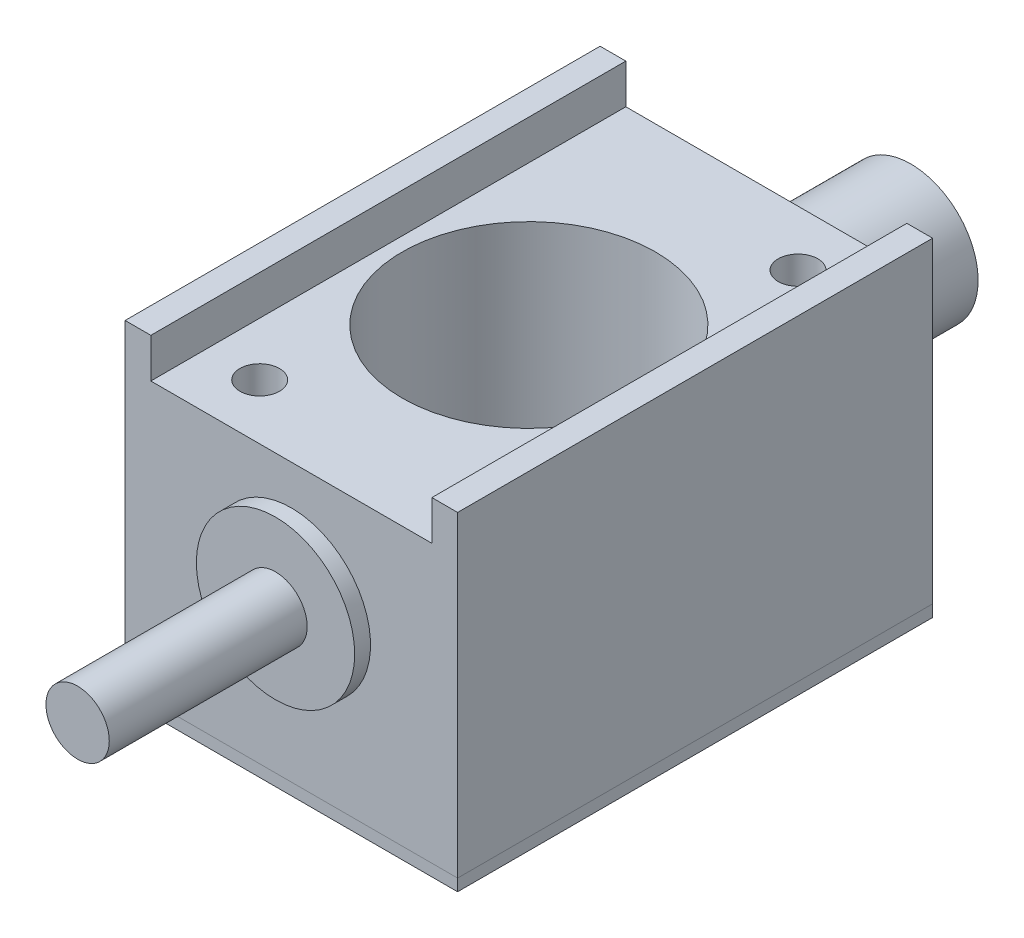
ISO-10303-21;
HEADER;
FILE_DESCRIPTION(('STEP AP214'),'2;1');
FILE_NAME('part.step','',(''),(''),'','','');
FILE_SCHEMA(('AUTOMOTIVE_DESIGN { 1 0 10303 214 1 1 1 1 }'));
ENDSEC;
DATA;
#1=APPLICATION_CONTEXT('core data for automotive mechanical design processes');
#2=APPLICATION_PROTOCOL_DEFINITION('international standard','automotive_design',2000,#1);
#3=PRODUCT_CONTEXT('',#1,'mechanical');
#4=PRODUCT('Part','Part','',(#3));
#5=PRODUCT_RELATED_PRODUCT_CATEGORY('part','',(#4));
#6=PRODUCT_DEFINITION_FORMATION('','',#4);
#7=PRODUCT_DEFINITION_CONTEXT('part definition',#1,'design');
#8=PRODUCT_DEFINITION('design','',#6,#7);
#9=PRODUCT_DEFINITION_SHAPE('','',#8);
#10=(LENGTH_UNIT() NAMED_UNIT(*) SI_UNIT(.MILLI.,.METRE.));
#11=(NAMED_UNIT(*) PLANE_ANGLE_UNIT() SI_UNIT($,.RADIAN.));
#12=(NAMED_UNIT(*) SI_UNIT($,.STERADIAN.) SOLID_ANGLE_UNIT());
#13=UNCERTAINTY_MEASURE_WITH_UNIT(LENGTH_MEASURE(1.E-05),#10,'distance_accuracy_value','');
#14=(GEOMETRIC_REPRESENTATION_CONTEXT(3) GLOBAL_UNCERTAINTY_ASSIGNED_CONTEXT((#13)) GLOBAL_UNIT_ASSIGNED_CONTEXT((#10,
#11,#12)) REPRESENTATION_CONTEXT('',''));
#15=CARTESIAN_POINT('',(0.,0.,0.));
#16=DIRECTION('',(0.,0.,1.));
#17=DIRECTION('',(1.,0.,0.));
#18=AXIS2_PLACEMENT_3D('',#15,#16,#17);
#19=CARTESIAN_POINT('',(0.,-21.5,0.));
#20=DIRECTION('',(0.,-1.,0.));
#21=DIRECTION('',(0.,0.,-1.));
#22=AXIS2_PLACEMENT_3D('',#19,#20,#21);
#23=PLANE('',#22);
#24=CARTESIAN_POINT('',(-11.2,-21.5,30.));
#25=DIRECTION('',(0.,-1.,0.));
#26=DIRECTION('',(0.,0.,-1.));
#27=AXIS2_PLACEMENT_3D('',#24,#25,#26);
#28=CIRCLE('',#27,1.55);
#29=CARTESIAN_POINT('',(-11.2,-21.5,28.45));
#30=VERTEX_POINT('',#29);
#31=EDGE_CURVE('E161',#30,#30,#28,.T.);
#32=ORIENTED_EDGE('',*,*,#31,.F.);
#33=EDGE_LOOP('',(#32));
#34=FACE_BOUND('',#33,.T.);
#35=CARTESIAN_POINT('',(0.,-21.5,40.7));
#36=DIRECTION('',(0.,-1.,0.));
#37=DIRECTION('',(0.,0.,-1.));
#38=AXIS2_PLACEMENT_3D('',#35,#36,#37);
#39=CIRCLE('',#38,1.6);
#40=CARTESIAN_POINT('',(0.,-21.5,39.1));
#41=VERTEX_POINT('',#40);
#42=EDGE_CURVE('E149',#41,#41,#39,.T.);
#43=ORIENTED_EDGE('',*,*,#42,.F.);
#44=EDGE_LOOP('',(#43));
#45=FACE_BOUND('',#44,.T.);
#46=CARTESIAN_POINT('',(11.,-21.5,7.));
#47=DIRECTION('',(0.,-1.,0.));
#48=DIRECTION('',(0.,0.,-1.));
#49=AXIS2_PLACEMENT_3D('',#46,#47,#48);
#50=CIRCLE('',#49,2.5);
#51=CARTESIAN_POINT('',(11.,-21.5,4.5));
#52=VERTEX_POINT('',#51);
#53=EDGE_CURVE('E137',#52,#52,#50,.T.);
#54=ORIENTED_EDGE('',*,*,#53,.F.);
#55=EDGE_LOOP('',(#54));
#56=FACE_BOUND('',#55,.T.);
#57=DIRECTION('',(0.,0.,-1.));
#58=VECTOR('',#57,1.);
#59=CARTESIAN_POINT('',(-21.,-21.5,60.));
#60=LINE('',#59,#58);
#61=CARTESIAN_POINT('',(-21.,-21.5,60.));
#62=VERTEX_POINT('',#61);
#63=CARTESIAN_POINT('',(-21.,-21.5,0.));
#64=VERTEX_POINT('',#63);
#65=EDGE_CURVE('E107',#62,#64,#60,.T.);
#66=ORIENTED_EDGE('',*,*,#65,.T.);
#67=DIRECTION('',(1.,0.,0.));
#68=VECTOR('',#67,1.);
#69=CARTESIAN_POINT('',(-21.,-21.5,0.));
#70=LINE('',#69,#68);
#71=CARTESIAN_POINT('',(21.,-21.5,0.));
#72=VERTEX_POINT('',#71);
#73=EDGE_CURVE('E102',#64,#72,#70,.T.);
#74=ORIENTED_EDGE('',*,*,#73,.T.);
#75=DIRECTION('',(0.,0.,1.));
#76=VECTOR('',#75,1.);
#77=CARTESIAN_POINT('',(21.,-21.5,60.));
#78=LINE('',#77,#76);
#79=CARTESIAN_POINT('',(21.,-21.5,60.));
#80=VERTEX_POINT('',#79);
#81=EDGE_CURVE('E105',#72,#80,#78,.T.);
#82=ORIENTED_EDGE('',*,*,#81,.T.);
#83=DIRECTION('',(-1.,0.,0.));
#84=VECTOR('',#83,1.);
#85=CARTESIAN_POINT('',(-21.,-21.5,60.));
#86=LINE('',#85,#84);
#87=EDGE_CURVE('E72',#80,#62,#86,.T.);
#88=ORIENTED_EDGE('',*,*,#87,.T.);
#89=EDGE_LOOP('',(#66,#74,#82,#88));
#90=FACE_BOUND('',#89,.T.);
#91=CARTESIAN_POINT('',(-11.,-21.5,53.));
#92=DIRECTION('',(0.,-1.,0.));
#93=DIRECTION('',(0.,0.,-1.));
#94=AXIS2_PLACEMENT_3D('',#91,#92,#93);
#95=CIRCLE('',#94,2.5);
#96=CARTESIAN_POINT('',(-11.,-21.5,50.5));
#97=VERTEX_POINT('',#96);
#98=EDGE_CURVE('E122',#97,#97,#95,.T.);
#99=ORIENTED_EDGE('',*,*,#98,.F.);
#100=EDGE_LOOP('',(#99));
#101=FACE_BOUND('',#100,.T.);
#102=CARTESIAN_POINT('',(0.,-21.5,30.));
#103=DIRECTION('',(0.,-1.,0.));
#104=DIRECTION('',(0.,0.,-1.));
#105=AXIS2_PLACEMENT_3D('',#102,#103,#104);
#106=CIRCLE('',#105,6.75);
#107=CARTESIAN_POINT('',(0.,-21.5,23.25));
#108=VERTEX_POINT('',#107);
#109=EDGE_CURVE('E143',#108,#108,#106,.T.);
#110=ORIENTED_EDGE('',*,*,#109,.F.);
#111=EDGE_LOOP('',(#110));
#112=FACE_BOUND('',#111,.T.);
#113=CARTESIAN_POINT('',(0.,-21.5,19.3));
#114=DIRECTION('',(0.,-1.,0.));
#115=DIRECTION('',(0.,0.,-1.));
#116=AXIS2_PLACEMENT_3D('',#113,#114,#115);
#117=CIRCLE('',#116,1.6);
#118=CARTESIAN_POINT('',(0.,-21.5,17.7));
#119=VERTEX_POINT('',#118);
#120=EDGE_CURVE('E155',#119,#119,#117,.T.);
#121=ORIENTED_EDGE('',*,*,#120,.F.);
#122=EDGE_LOOP('',(#121));
#123=FACE_BOUND('',#122,.T.);
#124=CARTESIAN_POINT('',(11.2,-21.5,30.));
#125=DIRECTION('',(0.,-1.,0.));
#126=DIRECTION('',(0.,0.,-1.));
#127=AXIS2_PLACEMENT_3D('',#124,#125,#126);
#128=CIRCLE('',#127,1.55);
#129=CARTESIAN_POINT('',(11.2,-21.5,28.45));
#130=VERTEX_POINT('',#129);
#131=EDGE_CURVE('E167',#130,#130,#128,.T.);
#132=ORIENTED_EDGE('',*,*,#131,.F.);
#133=EDGE_LOOP('',(#132));
#134=FACE_BOUND('',#133,.T.);
#135=ADVANCED_FACE('F55',(#34,#45,#56,#90,#101,#112,#123,#134),#23,.T.);
#136=CARTESIAN_POINT('',(0.,-20.,0.));
#137=DIRECTION('',(0.,-1.,0.));
#138=DIRECTION('',(0.,0.,-1.));
#139=AXIS2_PLACEMENT_3D('',#136,#137,#138);
#140=PLANE('',#139);
#141=DIRECTION('',(0.,0.,-1.));
#142=VECTOR('',#141,1.);
#143=CARTESIAN_POINT('',(-21.,-20.,60.));
#144=LINE('',#143,#142);
#145=CARTESIAN_POINT('',(-21.,-20.,60.));
#146=VERTEX_POINT('',#145);
#147=CARTESIAN_POINT('',(-21.,-20.,0.));
#148=VERTEX_POINT('',#147);
#149=EDGE_CURVE('E119',#146,#148,#144,.T.);
#150=ORIENTED_EDGE('',*,*,#149,.F.);
#151=DIRECTION('',(-1.,0.,0.));
#152=VECTOR('',#151,1.);
#153=CARTESIAN_POINT('',(-21.,-20.,60.));
#154=LINE('',#153,#152);
#155=CARTESIAN_POINT('',(21.,-20.,60.));
#156=VERTEX_POINT('',#155);
#157=EDGE_CURVE('E95',#156,#146,#154,.T.);
#158=ORIENTED_EDGE('',*,*,#157,.F.);
#159=DIRECTION('',(0.,0.,1.));
#160=VECTOR('',#159,1.);
#161=CARTESIAN_POINT('',(21.,-20.,60.));
#162=LINE('',#161,#160);
#163=CARTESIAN_POINT('',(21.,-20.,0.));
#164=VERTEX_POINT('',#163);
#165=EDGE_CURVE('E89',#164,#156,#162,.T.);
#166=ORIENTED_EDGE('',*,*,#165,.F.);
#167=DIRECTION('',(1.,0.,0.));
#168=VECTOR('',#167,1.);
#169=CARTESIAN_POINT('',(-21.,-20.,0.));
#170=LINE('',#169,#168);
#171=EDGE_CURVE('E111',#148,#164,#170,.T.);
#172=ORIENTED_EDGE('',*,*,#171,.F.);
#173=EDGE_LOOP('',(#150,#158,#166,#172));
#174=FACE_BOUND('',#173,.T.);
#175=CARTESIAN_POINT('',(-11.,-20.,53.));
#176=DIRECTION('',(0.,-1.,0.));
#177=DIRECTION('',(0.,0.,-1.));
#178=AXIS2_PLACEMENT_3D('',#175,#176,#177);
#179=CIRCLE('',#178,2.5);
#180=CARTESIAN_POINT('',(-11.,-20.,50.5));
#181=VERTEX_POINT('',#180);
#182=EDGE_CURVE('E134',#181,#181,#179,.T.);
#183=ORIENTED_EDGE('',*,*,#182,.T.);
#184=EDGE_LOOP('',(#183));
#185=FACE_BOUND('',#184,.T.);
#186=CARTESIAN_POINT('',(11.,-20.,7.));
#187=DIRECTION('',(0.,-1.,0.));
#188=DIRECTION('',(0.,0.,-1.));
#189=AXIS2_PLACEMENT_3D('',#186,#187,#188);
#190=CIRCLE('',#189,2.5);
#191=CARTESIAN_POINT('',(11.,-20.,4.5));
#192=VERTEX_POINT('',#191);
#193=EDGE_CURVE('E140',#192,#192,#190,.T.);
#194=ORIENTED_EDGE('',*,*,#193,.T.);
#195=EDGE_LOOP('',(#194));
#196=FACE_BOUND('',#195,.T.);
#197=CARTESIAN_POINT('',(0.,-20.,30.));
#198=DIRECTION('',(0.,-1.,0.));
#199=DIRECTION('',(0.,0.,-1.));
#200=AXIS2_PLACEMENT_3D('',#197,#198,#199);
#201=CIRCLE('',#200,6.75);
#202=CARTESIAN_POINT('',(0.,-20.,23.25));
#203=VERTEX_POINT('',#202);
#204=EDGE_CURVE('E146',#203,#203,#201,.T.);
#205=ORIENTED_EDGE('',*,*,#204,.T.);
#206=EDGE_LOOP('',(#205));
#207=FACE_BOUND('',#206,.T.);
#208=CARTESIAN_POINT('',(0.,-20.,40.7));
#209=DIRECTION('',(0.,-1.,0.));
#210=DIRECTION('',(0.,0.,-1.));
#211=AXIS2_PLACEMENT_3D('',#208,#209,#210);
#212=CIRCLE('',#211,1.6);
#213=CARTESIAN_POINT('',(0.,-20.,39.1));
#214=VERTEX_POINT('',#213);
#215=EDGE_CURVE('E152',#214,#214,#212,.T.);
#216=ORIENTED_EDGE('',*,*,#215,.T.);
#217=EDGE_LOOP('',(#216));
#218=FACE_BOUND('',#217,.T.);
#219=CARTESIAN_POINT('',(0.,-20.,19.3));
#220=DIRECTION('',(0.,-1.,0.));
#221=DIRECTION('',(0.,0.,-1.));
#222=AXIS2_PLACEMENT_3D('',#219,#220,#221);
#223=CIRCLE('',#222,1.6);
#224=CARTESIAN_POINT('',(0.,-20.,17.7));
#225=VERTEX_POINT('',#224);
#226=EDGE_CURVE('E158',#225,#225,#223,.T.);
#227=ORIENTED_EDGE('',*,*,#226,.T.);
#228=EDGE_LOOP('',(#227));
#229=FACE_BOUND('',#228,.T.);
#230=CARTESIAN_POINT('',(-11.2,-20.,30.));
#231=DIRECTION('',(0.,-1.,0.));
#232=DIRECTION('',(0.,0.,-1.));
#233=AXIS2_PLACEMENT_3D('',#230,#231,#232);
#234=CIRCLE('',#233,1.55);
#235=CARTESIAN_POINT('',(-11.2,-20.,28.45));
#236=VERTEX_POINT('',#235);
#237=EDGE_CURVE('E164',#236,#236,#234,.T.);
#238=ORIENTED_EDGE('',*,*,#237,.T.);
#239=EDGE_LOOP('',(#238));
#240=FACE_BOUND('',#239,.T.);
#241=CARTESIAN_POINT('',(11.2,-20.,30.));
#242=DIRECTION('',(0.,-1.,0.));
#243=DIRECTION('',(0.,0.,-1.));
#244=AXIS2_PLACEMENT_3D('',#241,#242,#243);
#245=CIRCLE('',#244,1.55);
#246=CARTESIAN_POINT('',(11.2,-20.,28.45));
#247=VERTEX_POINT('',#246);
#248=EDGE_CURVE('E170',#247,#247,#245,.T.);
#249=ORIENTED_EDGE('',*,*,#248,.T.);
#250=EDGE_LOOP('',(#249));
#251=FACE_BOUND('',#250,.T.);
#252=ADVANCED_FACE('F130',(#174,#185,#196,#207,#218,#229,#240,#251),#140,.F.);
#253=CARTESIAN_POINT('',(-21.,-21.5,60.));
#254=DIRECTION('',(1.,0.,0.));
#255=DIRECTION('',(0.,0.,-1.));
#256=AXIS2_PLACEMENT_3D('',#253,#254,#255);
#257=PLANE('',#256);
#258=ORIENTED_EDGE('',*,*,#149,.T.);
#259=DIRECTION('',(0.,1.,0.));
#260=VECTOR('',#259,1.);
#261=CARTESIAN_POINT('',(-21.,-21.5,0.));
#262=LINE('',#261,#260);
#263=EDGE_CURVE('E12',#64,#148,#262,.T.);
#264=ORIENTED_EDGE('',*,*,#263,.F.);
#265=ORIENTED_EDGE('',*,*,#65,.F.);
#266=DIRECTION('',(0.,1.,0.));
#267=VECTOR('',#266,1.);
#268=CARTESIAN_POINT('',(-21.,-21.5,60.));
#269=LINE('',#268,#267);
#270=EDGE_CURVE('E115',#62,#146,#269,.T.);
#271=ORIENTED_EDGE('',*,*,#270,.T.);
#272=EDGE_LOOP('',(#258,#264,#265,#271));
#273=FACE_BOUND('',#272,.T.);
#274=ADVANCED_FACE('F57',(#273),#257,.F.);
#275=CARTESIAN_POINT('',(-21.,-21.5,0.));
#276=DIRECTION('',(0.,0.,1.));
#277=DIRECTION('',(1.,0.,0.));
#278=AXIS2_PLACEMENT_3D('',#275,#276,#277);
#279=PLANE('',#278);
#280=ORIENTED_EDGE('',*,*,#171,.T.);
#281=DIRECTION('',(0.,1.,0.));
#282=VECTOR('',#281,1.);
#283=CARTESIAN_POINT('',(21.,-21.5,0.));
#284=LINE('',#283,#282);
#285=EDGE_CURVE('E64',#72,#164,#284,.T.);
#286=ORIENTED_EDGE('',*,*,#285,.F.);
#287=ORIENTED_EDGE('',*,*,#73,.F.);
#288=ORIENTED_EDGE('',*,*,#263,.T.);
#289=EDGE_LOOP('',(#280,#286,#287,#288));
#290=FACE_BOUND('',#289,.T.);
#291=ADVANCED_FACE('F110',(#290),#279,.F.);
#292=CARTESIAN_POINT('',(21.,-21.5,60.));
#293=DIRECTION('',(-1.,0.,0.));
#294=DIRECTION('',(0.,0.,1.));
#295=AXIS2_PLACEMENT_3D('',#292,#293,#294);
#296=PLANE('',#295);
#297=ORIENTED_EDGE('',*,*,#165,.T.);
#298=DIRECTION('',(0.,1.,0.));
#299=VECTOR('',#298,1.);
#300=CARTESIAN_POINT('',(21.,-21.5,60.));
#301=LINE('',#300,#299);
#302=EDGE_CURVE('E112',#80,#156,#301,.T.);
#303=ORIENTED_EDGE('',*,*,#302,.F.);
#304=ORIENTED_EDGE('',*,*,#81,.F.);
#305=ORIENTED_EDGE('',*,*,#285,.T.);
#306=EDGE_LOOP('',(#297,#303,#304,#305));
#307=FACE_BOUND('',#306,.T.);
#308=ADVANCED_FACE('F113',(#307),#296,.F.);
#309=CARTESIAN_POINT('',(-21.,-21.5,60.));
#310=DIRECTION('',(0.,0.,-1.));
#311=DIRECTION('',(-1.,0.,0.));
#312=AXIS2_PLACEMENT_3D('',#309,#310,#311);
#313=PLANE('',#312);
#314=ORIENTED_EDGE('',*,*,#157,.T.);
#315=ORIENTED_EDGE('',*,*,#270,.F.);
#316=ORIENTED_EDGE('',*,*,#87,.F.);
#317=ORIENTED_EDGE('',*,*,#302,.T.);
#318=EDGE_LOOP('',(#314,#315,#316,#317));
#319=FACE_BOUND('',#318,.T.);
#320=ADVANCED_FACE('F127',(#319),#313,.F.);
#321=CARTESIAN_POINT('',(-11.,-21.5,53.));
#322=DIRECTION('',(0.,1.,0.));
#323=DIRECTION('',(0.,0.,1.));
#324=AXIS2_PLACEMENT_3D('',#321,#322,#323);
#325=CYLINDRICAL_SURFACE('',#324,2.5);
#326=ORIENTED_EDGE('',*,*,#98,.T.);
#327=EDGE_LOOP('',(#326));
#328=FACE_BOUND('',#327,.T.);
#329=ORIENTED_EDGE('',*,*,#182,.F.);
#330=EDGE_LOOP('',(#329));
#331=FACE_BOUND('',#330,.T.);
#332=ADVANCED_FACE('F189',(#328,#331),#325,.F.);
#333=CARTESIAN_POINT('',(11.,-21.5,7.));
#334=DIRECTION('',(0.,1.,0.));
#335=DIRECTION('',(0.,0.,1.));
#336=AXIS2_PLACEMENT_3D('',#333,#334,#335);
#337=CYLINDRICAL_SURFACE('',#336,2.5);
#338=ORIENTED_EDGE('',*,*,#53,.T.);
#339=EDGE_LOOP('',(#338));
#340=FACE_BOUND('',#339,.T.);
#341=ORIENTED_EDGE('',*,*,#193,.F.);
#342=EDGE_LOOP('',(#341));
#343=FACE_BOUND('',#342,.T.);
#344=ADVANCED_FACE('F240',(#340,#343),#337,.F.);
#345=CARTESIAN_POINT('',(0.,-21.5,30.));
#346=DIRECTION('',(0.,1.,0.));
#347=DIRECTION('',(0.,0.,1.));
#348=AXIS2_PLACEMENT_3D('',#345,#346,#347);
#349=CYLINDRICAL_SURFACE('',#348,6.75);
#350=ORIENTED_EDGE('',*,*,#109,.T.);
#351=EDGE_LOOP('',(#350));
#352=FACE_BOUND('',#351,.T.);
#353=ORIENTED_EDGE('',*,*,#204,.F.);
#354=EDGE_LOOP('',(#353));
#355=FACE_BOUND('',#354,.T.);
#356=ADVANCED_FACE('F248',(#352,#355),#349,.F.);
#357=CARTESIAN_POINT('',(0.,-21.5,40.7));
#358=DIRECTION('',(0.,1.,0.));
#359=DIRECTION('',(0.,0.,1.));
#360=AXIS2_PLACEMENT_3D('',#357,#358,#359);
#361=CYLINDRICAL_SURFACE('',#360,1.6);
#362=ORIENTED_EDGE('',*,*,#42,.T.);
#363=EDGE_LOOP('',(#362));
#364=FACE_BOUND('',#363,.T.);
#365=ORIENTED_EDGE('',*,*,#215,.F.);
#366=EDGE_LOOP('',(#365));
#367=FACE_BOUND('',#366,.T.);
#368=ADVANCED_FACE('F256',(#364,#367),#361,.F.);
#369=CARTESIAN_POINT('',(0.,-21.5,19.3));
#370=DIRECTION('',(0.,1.,0.));
#371=DIRECTION('',(0.,0.,1.));
#372=AXIS2_PLACEMENT_3D('',#369,#370,#371);
#373=CYLINDRICAL_SURFACE('',#372,1.6);
#374=ORIENTED_EDGE('',*,*,#120,.T.);
#375=EDGE_LOOP('',(#374));
#376=FACE_BOUND('',#375,.T.);
#377=ORIENTED_EDGE('',*,*,#226,.F.);
#378=EDGE_LOOP('',(#377));
#379=FACE_BOUND('',#378,.T.);
#380=ADVANCED_FACE('F265',(#376,#379),#373,.F.);
#381=CARTESIAN_POINT('',(-11.2,-21.5,30.));
#382=DIRECTION('',(0.,1.,0.));
#383=DIRECTION('',(0.,0.,1.));
#384=AXIS2_PLACEMENT_3D('',#381,#382,#383);
#385=CYLINDRICAL_SURFACE('',#384,1.55);
#386=ORIENTED_EDGE('',*,*,#31,.T.);
#387=EDGE_LOOP('',(#386));
#388=FACE_BOUND('',#387,.T.);
#389=ORIENTED_EDGE('',*,*,#237,.F.);
#390=EDGE_LOOP('',(#389));
#391=FACE_BOUND('',#390,.T.);
#392=ADVANCED_FACE('F274',(#388,#391),#385,.F.);
#393=CARTESIAN_POINT('',(11.2,-21.5,30.));
#394=DIRECTION('',(0.,1.,0.));
#395=DIRECTION('',(0.,0.,1.));
#396=AXIS2_PLACEMENT_3D('',#393,#394,#395);
#397=CYLINDRICAL_SURFACE('',#396,1.55);
#398=ORIENTED_EDGE('',*,*,#131,.T.);
#399=EDGE_LOOP('',(#398));
#400=FACE_BOUND('',#399,.T.);
#401=ORIENTED_EDGE('',*,*,#248,.F.);
#402=EDGE_LOOP('',(#401));
#403=FACE_BOUND('',#402,.T.);
#404=ADVANCED_FACE('F176',(#400,#403),#397,.F.);
#405=CLOSED_SHELL('',(#135,#252,#274,#291,#308,#320,#332,#344,#356,#368,#380,#392,#404));
#406=MANIFOLD_SOLID_BREP('B2',#405);
#407=CARTESIAN_POINT('',(-21.,20.,60.));
#408=DIRECTION('',(0.,-1.,0.));
#409=DIRECTION('',(0.,0.,-1.));
#410=AXIS2_PLACEMENT_3D('',#407,#408,#409);
#411=PLANE('',#410);
#412=DIRECTION('',(0.,0.,1.));
#413=VECTOR('',#412,1.);
#414=CARTESIAN_POINT('',(17.75,20.,0.));
#415=LINE('',#414,#413);
#416=CARTESIAN_POINT('',(17.75,20.,0.));
#417=VERTEX_POINT('',#416);
#418=CARTESIAN_POINT('',(17.75,20.,60.));
#419=VERTEX_POINT('',#418);
#420=EDGE_CURVE('E458',#417,#419,#415,.T.);
#421=ORIENTED_EDGE('',*,*,#420,.T.);
#422=DIRECTION('',(-1.,0.,0.));
#423=VECTOR('',#422,1.);
#424=CARTESIAN_POINT('',(-21.,20.,60.));
#425=LINE('',#424,#423);
#426=CARTESIAN_POINT('',(21.,20.,60.));
#427=VERTEX_POINT('',#426);
#428=EDGE_CURVE('E407',#427,#419,#425,.T.);
#429=ORIENTED_EDGE('',*,*,#428,.F.);
#430=DIRECTION('',(0.,0.,-1.));
#431=VECTOR('',#430,1.);
#432=CARTESIAN_POINT('',(21.,20.,60.));
#433=LINE('',#432,#431);
#434=CARTESIAN_POINT('',(21.,20.,0.));
#435=VERTEX_POINT('',#434);
#436=EDGE_CURVE('E471',#427,#435,#433,.T.);
#437=ORIENTED_EDGE('',*,*,#436,.T.);
#438=DIRECTION('',(-1.,0.,0.));
#439=VECTOR('',#438,1.);
#440=CARTESIAN_POINT('',(-21.,20.,0.));
#441=LINE('',#440,#439);
#442=EDGE_CURVE('E453',#435,#417,#441,.T.);
#443=ORIENTED_EDGE('',*,*,#442,.T.);
#444=EDGE_LOOP('',(#421,#429,#437,#443));
#445=FACE_BOUND('',#444,.T.);
#446=ADVANCED_FACE('F352',(#445),#411,.F.);
#447=CARTESIAN_POINT('',(0.,0.,60.));
#448=DIRECTION('',(0.,0.,-1.));
#449=DIRECTION('',(-1.,0.,0.));
#450=AXIS2_PLACEMENT_3D('',#447,#448,#449);
#451=PLANE('',#450);
#452=CARTESIAN_POINT('',(0.,0.,60.));
#453=DIRECTION('',(0.,0.,-1.));
#454=DIRECTION('',(-1.,0.,0.));
#455=AXIS2_PLACEMENT_3D('',#452,#453,#454);
#456=CIRCLE('',#455,10.);
#457=CARTESIAN_POINT('',(-10.,0.,60.));
#458=VERTEX_POINT('',#457);
#459=EDGE_CURVE('E361',#458,#458,#456,.F.);
#460=ORIENTED_EDGE('',*,*,#459,.F.);
#461=EDGE_LOOP('',(#460));
#462=FACE_BOUND('',#461,.T.);
#463=DIRECTION('',(0.,-1.,0.));
#464=VECTOR('',#463,1.);
#465=CARTESIAN_POINT('',(17.75,0.,60.));
#466=LINE('',#465,#464);
#467=CARTESIAN_POINT('',(17.75,15.,60.));
#468=VERTEX_POINT('',#467);
#469=EDGE_CURVE('E439',#419,#468,#466,.T.);
#470=ORIENTED_EDGE('',*,*,#469,.T.);
#471=DIRECTION('',(1.,0.,0.));
#472=VECTOR('',#471,1.);
#473=CARTESIAN_POINT('',(0.,15.,60.));
#474=LINE('',#473,#472);
#475=CARTESIAN_POINT('',(-17.75,15.,60.));
#476=VERTEX_POINT('',#475);
#477=EDGE_CURVE('E522',#476,#468,#474,.T.);
#478=ORIENTED_EDGE('',*,*,#477,.F.);
#479=DIRECTION('',(0.,-1.,0.));
#480=VECTOR('',#479,1.);
#481=CARTESIAN_POINT('',(-17.75,0.,60.));
#482=LINE('',#481,#480);
#483=CARTESIAN_POINT('',(-17.75,20.,60.));
#484=VERTEX_POINT('',#483);
#485=EDGE_CURVE('E517',#484,#476,#482,.T.);
#486=ORIENTED_EDGE('',*,*,#485,.F.);
#487=CARTESIAN_POINT('',(-21.,20.,60.));
#488=VERTEX_POINT('',#487);
#489=EDGE_CURVE('E447',#484,#488,#425,.T.);
#490=ORIENTED_EDGE('',*,*,#489,.T.);
#491=DIRECTION('',(0.,-1.,0.));
#492=VECTOR('',#491,1.);
#493=CARTESIAN_POINT('',(-21.,-20.,60.));
#494=LINE('',#493,#492);
#495=CARTESIAN_POINT('',(-21.,-20.,60.));
#496=VERTEX_POINT('',#495);
#497=EDGE_CURVE('E533',#488,#496,#494,.T.);
#498=ORIENTED_EDGE('',*,*,#497,.T.);
#499=DIRECTION('',(1.,0.,0.));
#500=VECTOR('',#499,1.);
#501=CARTESIAN_POINT('',(-21.,-20.,60.));
#502=LINE('',#501,#500);
#503=CARTESIAN_POINT('',(21.,-20.,60.));
#504=VERTEX_POINT('',#503);
#505=EDGE_CURVE('E378',#496,#504,#502,.T.);
#506=ORIENTED_EDGE('',*,*,#505,.T.);
#507=DIRECTION('',(0.,1.,0.));
#508=VECTOR('',#507,1.);
#509=CARTESIAN_POINT('',(21.,-20.,60.));
#510=LINE('',#509,#508);
#511=EDGE_CURVE('E464',#504,#427,#510,.T.);
#512=ORIENTED_EDGE('',*,*,#511,.T.);
#513=ORIENTED_EDGE('',*,*,#428,.T.);
#514=EDGE_LOOP('',(#470,#478,#486,#490,#498,#506,#512,#513));
#515=FACE_BOUND('',#514,.T.);
#516=ADVANCED_FACE('F536',(#462,#515),#451,.F.);
#517=CARTESIAN_POINT('',(0.,0.,0.));
#518=DIRECTION('',(0.,0.,-1.));
#519=DIRECTION('',(-1.,0.,0.));
#520=AXIS2_PLACEMENT_3D('',#517,#518,#519);
#521=PLANE('',#520);
#522=CARTESIAN_POINT('',(0.,0.,0.));
#523=DIRECTION('',(0.,0.,-1.));
#524=DIRECTION('',(-1.,0.,0.));
#525=AXIS2_PLACEMENT_3D('',#522,#523,#524);
#526=CIRCLE('',#525,12.5);
#527=CARTESIAN_POINT('',(-12.5,0.,0.));
#528=VERTEX_POINT('',#527);
#529=EDGE_CURVE('E505',#528,#528,#526,.T.);
#530=ORIENTED_EDGE('',*,*,#529,.F.);
#531=EDGE_LOOP('',(#530));
#532=FACE_BOUND('',#531,.T.);
#533=DIRECTION('',(1.,0.,0.));
#534=VECTOR('',#533,1.);
#535=CARTESIAN_POINT('',(0.,15.,0.));
#536=LINE('',#535,#534);
#537=CARTESIAN_POINT('',(-17.75,15.,0.));
#538=VERTEX_POINT('',#537);
#539=CARTESIAN_POINT('',(17.75,15.,0.));
#540=VERTEX_POINT('',#539);
#541=EDGE_CURVE('E369',#538,#540,#536,.T.);
#542=ORIENTED_EDGE('',*,*,#541,.T.);
#543=DIRECTION('',(0.,-1.,0.));
#544=VECTOR('',#543,1.);
#545=CARTESIAN_POINT('',(17.75,0.,0.));
#546=LINE('',#545,#544);
#547=EDGE_CURVE('E448',#417,#540,#546,.T.);
#548=ORIENTED_EDGE('',*,*,#547,.F.);
#549=ORIENTED_EDGE('',*,*,#442,.F.);
#550=DIRECTION('',(0.,1.,0.));
#551=VECTOR('',#550,1.);
#552=CARTESIAN_POINT('',(21.,-20.,0.));
#553=LINE('',#552,#551);
#554=CARTESIAN_POINT('',(21.,-20.,0.));
#555=VERTEX_POINT('',#554);
#556=EDGE_CURVE('E454',#555,#435,#553,.T.);
#557=ORIENTED_EDGE('',*,*,#556,.F.);
#558=DIRECTION('',(1.,0.,0.));
#559=VECTOR('',#558,1.);
#560=CARTESIAN_POINT('',(-21.,-20.,0.));
#561=LINE('',#560,#559);
#562=CARTESIAN_POINT('',(-21.,-20.,0.));
#563=VERTEX_POINT('',#562);
#564=EDGE_CURVE('E399',#563,#555,#561,.T.);
#565=ORIENTED_EDGE('',*,*,#564,.F.);
#566=DIRECTION('',(0.,-1.,0.));
#567=VECTOR('',#566,1.);
#568=CARTESIAN_POINT('',(-21.,-20.,0.));
#569=LINE('',#568,#567);
#570=CARTESIAN_POINT('',(-21.,20.,0.));
#571=VERTEX_POINT('',#570);
#572=EDGE_CURVE('E452',#571,#563,#569,.T.);
#573=ORIENTED_EDGE('',*,*,#572,.F.);
#574=CARTESIAN_POINT('',(-17.75,20.,0.));
#575=VERTEX_POINT('',#574);
#576=EDGE_CURVE('E445',#575,#571,#441,.T.);
#577=ORIENTED_EDGE('',*,*,#576,.F.);
#578=DIRECTION('',(0.,-1.,0.));
#579=VECTOR('',#578,1.);
#580=CARTESIAN_POINT('',(-17.75,0.,0.));
#581=LINE('',#580,#579);
#582=EDGE_CURVE('E430',#575,#538,#581,.T.);
#583=ORIENTED_EDGE('',*,*,#582,.T.);
#584=EDGE_LOOP('',(#542,#548,#549,#557,#565,#573,#577,#583));
#585=FACE_BOUND('',#584,.T.);
#586=ADVANCED_FACE('F451',(#532,#585),#521,.T.);
#587=CARTESIAN_POINT('',(21.,-20.,60.));
#588=DIRECTION('',(-1.,0.,0.));
#589=DIRECTION('',(0.,0.,1.));
#590=AXIS2_PLACEMENT_3D('',#587,#588,#589);
#591=PLANE('',#590);
#592=ORIENTED_EDGE('',*,*,#556,.T.);
#593=ORIENTED_EDGE('',*,*,#436,.F.);
#594=ORIENTED_EDGE('',*,*,#511,.F.);
#595=DIRECTION('',(0.,0.,-1.));
#596=VECTOR('',#595,1.);
#597=CARTESIAN_POINT('',(21.,-20.,60.));
#598=LINE('',#597,#596);
#599=EDGE_CURVE('E465',#504,#555,#598,.T.);
#600=ORIENTED_EDGE('',*,*,#599,.T.);
#601=EDGE_LOOP('',(#592,#593,#594,#600));
#602=FACE_BOUND('',#601,.T.);
#603=ADVANCED_FACE('F354',(#602),#591,.F.);
#604=ORIENTED_EDGE('',*,*,#489,.F.);
#605=DIRECTION('',(0.,0.,1.));
#606=VECTOR('',#605,1.);
#607=CARTESIAN_POINT('',(-17.75,20.,0.));
#608=LINE('',#607,#606);
#609=EDGE_CURVE('E434',#575,#484,#608,.T.);
#610=ORIENTED_EDGE('',*,*,#609,.F.);
#611=ORIENTED_EDGE('',*,*,#576,.T.);
#612=DIRECTION('',(0.,0.,-1.));
#613=VECTOR('',#612,1.);
#614=CARTESIAN_POINT('',(-21.,20.,60.));
#615=LINE('',#614,#613);
#616=EDGE_CURVE('E469',#488,#571,#615,.T.);
#617=ORIENTED_EDGE('',*,*,#616,.F.);
#618=EDGE_LOOP('',(#604,#610,#611,#617));
#619=FACE_BOUND('',#618,.T.);
#620=ADVANCED_FACE('F443',(#619),#411,.F.);
#621=CARTESIAN_POINT('',(-21.,-20.,60.));
#622=DIRECTION('',(1.,0.,0.));
#623=DIRECTION('',(0.,0.,-1.));
#624=AXIS2_PLACEMENT_3D('',#621,#622,#623);
#625=PLANE('',#624);
#626=ORIENTED_EDGE('',*,*,#572,.T.);
#627=DIRECTION('',(0.,0.,-1.));
#628=VECTOR('',#627,1.);
#629=CARTESIAN_POINT('',(-21.,-20.,60.));
#630=LINE('',#629,#628);
#631=EDGE_CURVE('E467',#496,#563,#630,.T.);
#632=ORIENTED_EDGE('',*,*,#631,.F.);
#633=ORIENTED_EDGE('',*,*,#497,.F.);
#634=ORIENTED_EDGE('',*,*,#616,.T.);
#635=EDGE_LOOP('',(#626,#632,#633,#634));
#636=FACE_BOUND('',#635,.T.);
#637=ADVANCED_FACE('F538',(#636),#625,.F.);
#638=CARTESIAN_POINT('',(-21.,-20.,60.));
#639=DIRECTION('',(0.,1.,0.));
#640=DIRECTION('',(0.,0.,1.));
#641=AXIS2_PLACEMENT_3D('',#638,#639,#640);
#642=PLANE('',#641);
#643=CARTESIAN_POINT('',(-11.,-20.,53.));
#644=DIRECTION('',(0.,-1.,0.));
#645=DIRECTION('',(0.,0.,-1.));
#646=AXIS2_PLACEMENT_3D('',#643,#644,#645);
#647=CIRCLE('',#646,2.5);
#648=CARTESIAN_POINT('',(-11.,-20.,50.5));
#649=VERTEX_POINT('',#648);
#650=EDGE_CURVE('E481',#649,#649,#647,.T.);
#651=ORIENTED_EDGE('',*,*,#650,.F.);
#652=EDGE_LOOP('',(#651));
#653=FACE_BOUND('',#652,.T.);
#654=CARTESIAN_POINT('',(11.,-20.,7.));
#655=DIRECTION('',(0.,-1.,0.));
#656=DIRECTION('',(0.,0.,-1.));
#657=AXIS2_PLACEMENT_3D('',#654,#655,#656);
#658=CIRCLE('',#657,2.5);
#659=CARTESIAN_POINT('',(11.,-20.,4.5));
#660=VERTEX_POINT('',#659);
#661=EDGE_CURVE('E487',#660,#660,#658,.T.);
#662=ORIENTED_EDGE('',*,*,#661,.F.);
#663=EDGE_LOOP('',(#662));
#664=FACE_BOUND('',#663,.T.);
#665=CARTESIAN_POINT('',(0.,-20.,30.));
#666=DIRECTION('',(0.,1.,0.));
#667=DIRECTION('',(0.,0.,1.));
#668=AXIS2_PLACEMENT_3D('',#665,#666,#667);
#669=CIRCLE('',#668,16.);
#670=CARTESIAN_POINT('',(0.,-20.,46.));
#671=VERTEX_POINT('',#670);
#672=EDGE_CURVE('E515',#671,#671,#669,.T.);
#673=ORIENTED_EDGE('',*,*,#672,.T.);
#674=EDGE_LOOP('',(#673));
#675=FACE_BOUND('',#674,.T.);
#676=ORIENTED_EDGE('',*,*,#564,.T.);
#677=ORIENTED_EDGE('',*,*,#599,.F.);
#678=ORIENTED_EDGE('',*,*,#505,.F.);
#679=ORIENTED_EDGE('',*,*,#631,.T.);
#680=EDGE_LOOP('',(#676,#677,#678,#679));
#681=FACE_BOUND('',#680,.T.);
#682=ADVANCED_FACE('F539',(#653,#664,#675,#681),#642,.F.);
#683=CARTESIAN_POINT('',(17.75,0.,0.));
#684=DIRECTION('',(-1.,0.,0.));
#685=DIRECTION('',(0.,0.,1.));
#686=AXIS2_PLACEMENT_3D('',#683,#684,#685);
#687=PLANE('',#686);
#688=ORIENTED_EDGE('',*,*,#469,.F.);
#689=ORIENTED_EDGE('',*,*,#420,.F.);
#690=ORIENTED_EDGE('',*,*,#547,.T.);
#691=DIRECTION('',(0.,0.,1.));
#692=VECTOR('',#691,1.);
#693=CARTESIAN_POINT('',(17.75,15.,0.));
#694=LINE('',#693,#692);
#695=EDGE_CURVE('E528',#540,#468,#694,.T.);
#696=ORIENTED_EDGE('',*,*,#695,.T.);
#697=EDGE_LOOP('',(#688,#689,#690,#696));
#698=FACE_BOUND('',#697,.T.);
#699=ADVANCED_FACE('F546',(#698),#687,.T.);
#700=CARTESIAN_POINT('',(0.,15.,0.));
#701=DIRECTION('',(0.,-1.,0.));
#702=DIRECTION('',(1.,0.,0.));
#703=AXIS2_PLACEMENT_3D('',#700,#701,#702);
#704=PLANE('',#703);
#705=CARTESIAN_POINT('',(-11.,15.,53.));
#706=DIRECTION('',(0.,-1.,0.));
#707=DIRECTION('',(1.,0.,0.));
#708=AXIS2_PLACEMENT_3D('',#705,#706,#707);
#709=CIRCLE('',#708,2.5);
#710=CARTESIAN_POINT('',(-8.50000000000001,15.,53.));
#711=VERTEX_POINT('',#710);
#712=EDGE_CURVE('E356',#711,#711,#709,.T.);
#713=ORIENTED_EDGE('',*,*,#712,.T.);
#714=EDGE_LOOP('',(#713));
#715=FACE_BOUND('',#714,.T.);
#716=CARTESIAN_POINT('',(11.,15.,7.));
#717=DIRECTION('',(0.,-1.,0.));
#718=DIRECTION('',(1.,0.,0.));
#719=AXIS2_PLACEMENT_3D('',#716,#717,#718);
#720=CIRCLE('',#719,2.5);
#721=CARTESIAN_POINT('',(13.5,15.,7.));
#722=VERTEX_POINT('',#721);
#723=EDGE_CURVE('E479',#722,#722,#720,.T.);
#724=ORIENTED_EDGE('',*,*,#723,.T.);
#725=EDGE_LOOP('',(#724));
#726=FACE_BOUND('',#725,.T.);
#727=CARTESIAN_POINT('',(0.,15.,30.));
#728=DIRECTION('',(0.,1.,0.));
#729=DIRECTION('',(0.,0.,1.));
#730=AXIS2_PLACEMENT_3D('',#727,#728,#729);
#731=CIRCLE('',#730,16.);
#732=CARTESIAN_POINT('',(0.,15.,46.));
#733=VERTEX_POINT('',#732);
#734=EDGE_CURVE('E512',#733,#733,#731,.T.);
#735=ORIENTED_EDGE('',*,*,#734,.F.);
#736=EDGE_LOOP('',(#735));
#737=FACE_BOUND('',#736,.T.);
#738=ORIENTED_EDGE('',*,*,#477,.T.);
#739=ORIENTED_EDGE('',*,*,#695,.F.);
#740=ORIENTED_EDGE('',*,*,#541,.F.);
#741=DIRECTION('',(0.,0.,1.));
#742=VECTOR('',#741,1.);
#743=CARTESIAN_POINT('',(-17.75,15.,0.));
#744=LINE('',#743,#742);
#745=EDGE_CURVE('E436',#538,#476,#744,.T.);
#746=ORIENTED_EDGE('',*,*,#745,.T.);
#747=EDGE_LOOP('',(#738,#739,#740,#746));
#748=FACE_BOUND('',#747,.T.);
#749=ADVANCED_FACE('F548',(#715,#726,#737,#748),#704,.F.);
#750=CARTESIAN_POINT('',(-17.75,0.,0.));
#751=DIRECTION('',(-1.,0.,0.));
#752=DIRECTION('',(0.,0.,1.));
#753=AXIS2_PLACEMENT_3D('',#750,#751,#752);
#754=PLANE('',#753);
#755=ORIENTED_EDGE('',*,*,#485,.T.);
#756=ORIENTED_EDGE('',*,*,#745,.F.);
#757=ORIENTED_EDGE('',*,*,#582,.F.);
#758=ORIENTED_EDGE('',*,*,#609,.T.);
#759=EDGE_LOOP('',(#755,#756,#757,#758));
#760=FACE_BOUND('',#759,.T.);
#761=ADVANCED_FACE('F433',(#760),#754,.F.);
#762=CARTESIAN_POINT('',(0.,-25.,30.));
#763=DIRECTION('',(0.,1.,0.));
#764=DIRECTION('',(0.,0.,1.));
#765=AXIS2_PLACEMENT_3D('',#762,#763,#764);
#766=CYLINDRICAL_SURFACE('',#765,16.);
#767=ORIENTED_EDGE('',*,*,#734,.T.);
#768=EDGE_LOOP('',(#767));
#769=FACE_BOUND('',#768,.T.);
#770=ORIENTED_EDGE('',*,*,#672,.F.);
#771=EDGE_LOOP('',(#770));
#772=FACE_BOUND('',#771,.T.);
#773=ADVANCED_FACE('F557',(#769,#772),#766,.F.);
#774=CARTESIAN_POINT('',(0.,0.,-2.));
#775=DIRECTION('',(0.,0.,1.));
#776=DIRECTION('',(1.,0.,0.));
#777=AXIS2_PLACEMENT_3D('',#774,#775,#776);
#778=CYLINDRICAL_SURFACE('',#777,12.5);
#779=CARTESIAN_POINT('',(0.,0.,-2.));
#780=DIRECTION('',(0.,0.,-1.));
#781=DIRECTION('',(-1.,0.,0.));
#782=AXIS2_PLACEMENT_3D('',#779,#780,#781);
#783=CIRCLE('',#782,12.5);
#784=CARTESIAN_POINT('',(-12.5,0.,-2.));
#785=VERTEX_POINT('',#784);
#786=EDGE_CURVE('E477',#785,#785,#783,.T.);
#787=ORIENTED_EDGE('',*,*,#786,.F.);
#788=EDGE_LOOP('',(#787));
#789=FACE_BOUND('',#788,.T.);
#790=ORIENTED_EDGE('',*,*,#529,.T.);
#791=EDGE_LOOP('',(#790));
#792=FACE_BOUND('',#791,.T.);
#793=ADVANCED_FACE('F593',(#789,#792),#778,.T.);
#794=CARTESIAN_POINT('',(0.,0.,-2.));
#795=DIRECTION('',(0.,0.,-1.));
#796=DIRECTION('',(-1.,0.,0.));
#797=AXIS2_PLACEMENT_3D('',#794,#795,#796);
#798=PLANE('',#797);
#799=CARTESIAN_POINT('',(0.,0.,-2.));
#800=DIRECTION('',(0.,0.,-1.));
#801=DIRECTION('',(-1.,0.,0.));
#802=AXIS2_PLACEMENT_3D('',#799,#800,#801);
#803=CIRCLE('',#802,8.5);
#804=CARTESIAN_POINT('',(-8.5,0.,-2.));
#805=VERTEX_POINT('',#804);
#806=EDGE_CURVE('E473',#805,#805,#803,.T.);
#807=ORIENTED_EDGE('',*,*,#806,.F.);
#808=EDGE_LOOP('',(#807));
#809=FACE_BOUND('',#808,.T.);
#810=ORIENTED_EDGE('',*,*,#786,.T.);
#811=EDGE_LOOP('',(#810));
#812=FACE_BOUND('',#811,.T.);
#813=ADVANCED_FACE('F598',(#809,#812),#798,.T.);
#814=CARTESIAN_POINT('',(0.,0.,-18.25));
#815=DIRECTION('',(0.,0.,-1.));
#816=DIRECTION('',(-1.,0.,0.));
#817=AXIS2_PLACEMENT_3D('',#814,#815,#816);
#818=PLANE('',#817);
#819=CARTESIAN_POINT('',(0.,0.,-18.25));
#820=DIRECTION('',(0.,0.,-1.));
#821=DIRECTION('',(-1.,0.,0.));
#822=AXIS2_PLACEMENT_3D('',#819,#820,#821);
#823=CIRCLE('',#822,2.5);
#824=CARTESIAN_POINT('',(-2.5,0.,-18.25));
#825=VERTEX_POINT('',#824);
#826=EDGE_CURVE('E485',#825,#825,#823,.T.);
#827=ORIENTED_EDGE('',*,*,#826,.F.);
#828=EDGE_LOOP('',(#827));
#829=FACE_BOUND('',#828,.T.);
#830=CARTESIAN_POINT('',(0.,0.,-18.25));
#831=DIRECTION('',(0.,0.,-1.));
#832=DIRECTION('',(-1.,0.,0.));
#833=AXIS2_PLACEMENT_3D('',#830,#831,#832);
#834=CIRCLE('',#833,8.5);
#835=CARTESIAN_POINT('',(-8.5,0.,-18.25));
#836=VERTEX_POINT('',#835);
#837=EDGE_CURVE('E476',#836,#836,#834,.T.);
#838=ORIENTED_EDGE('',*,*,#837,.T.);
#839=EDGE_LOOP('',(#838));
#840=FACE_BOUND('',#839,.T.);
#841=ADVANCED_FACE('F606',(#829,#840),#818,.T.);
#842=CARTESIAN_POINT('',(0.,0.,-18.25));
#843=DIRECTION('',(0.,0.,1.));
#844=DIRECTION('',(1.,0.,0.));
#845=AXIS2_PLACEMENT_3D('',#842,#843,#844);
#846=CYLINDRICAL_SURFACE('',#845,8.5);
#847=ORIENTED_EDGE('',*,*,#806,.T.);
#848=EDGE_LOOP('',(#847));
#849=FACE_BOUND('',#848,.T.);
#850=ORIENTED_EDGE('',*,*,#837,.F.);
#851=EDGE_LOOP('',(#850));
#852=FACE_BOUND('',#851,.T.);
#853=ADVANCED_FACE('F602',(#849,#852),#846,.T.);
#854=CARTESIAN_POINT('',(0.,0.,62.));
#855=DIRECTION('',(0.,0.,-1.));
#856=DIRECTION('',(-1.,0.,0.));
#857=AXIS2_PLACEMENT_3D('',#854,#855,#856);
#858=CYLINDRICAL_SURFACE('',#857,10.);
#859=CARTESIAN_POINT('',(0.,0.,62.));
#860=DIRECTION('',(0.,0.,1.));
#861=DIRECTION('',(1.,0.,0.));
#862=AXIS2_PLACEMENT_3D('',#859,#860,#861);
#863=CIRCLE('',#862,10.);
#864=CARTESIAN_POINT('',(10.,0.,62.));
#865=VERTEX_POINT('',#864);
#866=EDGE_CURVE('E501',#865,#865,#863,.T.);
#867=ORIENTED_EDGE('',*,*,#866,.F.);
#868=EDGE_LOOP('',(#867));
#869=FACE_BOUND('',#868,.T.);
#870=ORIENTED_EDGE('',*,*,#459,.T.);
#871=EDGE_LOOP('',(#870));
#872=FACE_BOUND('',#871,.T.);
#873=ADVANCED_FACE('F605',(#869,#872),#858,.T.);
#874=CARTESIAN_POINT('',(0.,0.,62.));
#875=DIRECTION('',(0.,0.,1.));
#876=DIRECTION('',(1.,0.,0.));
#877=AXIS2_PLACEMENT_3D('',#874,#875,#876);
#878=PLANE('',#877);
#879=CARTESIAN_POINT('',(0.,0.,62.));
#880=DIRECTION('',(0.,0.,1.));
#881=DIRECTION('',(1.,0.,0.));
#882=AXIS2_PLACEMENT_3D('',#879,#880,#881);
#883=CIRCLE('',#882,4.);
#884=CARTESIAN_POINT('',(4.,0.,62.));
#885=VERTEX_POINT('',#884);
#886=EDGE_CURVE('E53',#885,#885,#883,.T.);
#887=ORIENTED_EDGE('',*,*,#886,.F.);
#888=EDGE_LOOP('',(#887));
#889=FACE_BOUND('',#888,.T.);
#890=ORIENTED_EDGE('',*,*,#866,.T.);
#891=EDGE_LOOP('',(#890));
#892=FACE_BOUND('',#891,.T.);
#893=ADVANCED_FACE('F616',(#889,#892),#878,.T.);
#894=CARTESIAN_POINT('',(0.,0.,87.));
#895=DIRECTION('',(0.,0.,-1.));
#896=DIRECTION('',(-1.,0.,0.));
#897=AXIS2_PLACEMENT_3D('',#894,#895,#896);
#898=CYLINDRICAL_SURFACE('',#897,4.);
#899=CARTESIAN_POINT('',(0.,0.,87.));
#900=DIRECTION('',(0.,0.,1.));
#901=DIRECTION('',(1.,0.,0.));
#902=AXIS2_PLACEMENT_3D('',#899,#900,#901);
#903=CIRCLE('',#902,4.);
#904=CARTESIAN_POINT('',(4.,0.,87.));
#905=VERTEX_POINT('',#904);
#906=EDGE_CURVE('E497',#905,#905,#903,.T.);
#907=ORIENTED_EDGE('',*,*,#906,.F.);
#908=EDGE_LOOP('',(#907));
#909=FACE_BOUND('',#908,.T.);
#910=ORIENTED_EDGE('',*,*,#886,.T.);
#911=EDGE_LOOP('',(#910));
#912=FACE_BOUND('',#911,.T.);
#913=ADVANCED_FACE('F620',(#909,#912),#898,.T.);
#914=CARTESIAN_POINT('',(0.,0.,87.));
#915=DIRECTION('',(0.,0.,1.));
#916=DIRECTION('',(1.,0.,0.));
#917=AXIS2_PLACEMENT_3D('',#914,#915,#916);
#918=PLANE('',#917);
#919=ORIENTED_EDGE('',*,*,#906,.T.);
#920=EDGE_LOOP('',(#919));
#921=FACE_BOUND('',#920,.T.);
#922=ADVANCED_FACE('F624',(#921),#918,.T.);
#923=CARTESIAN_POINT('',(0.,0.,13.75));
#924=DIRECTION('',(0.,0.,-1.));
#925=DIRECTION('',(-1.,0.,0.));
#926=AXIS2_PLACEMENT_3D('',#923,#924,#925);
#927=CYLINDRICAL_SURFACE('',#926,2.5);
#928=CARTESIAN_POINT('',(0.,0.,13.75));
#929=DIRECTION('',(0.,0.,-1.));
#930=DIRECTION('',(-1.,0.,0.));
#931=AXIS2_PLACEMENT_3D('',#928,#929,#930);
#932=CIRCLE('',#931,2.5);
#933=CARTESIAN_POINT('',(-2.5,0.,13.75));
#934=VERTEX_POINT('',#933);
#935=EDGE_CURVE('E494',#934,#934,#932,.T.);
#936=ORIENTED_EDGE('',*,*,#935,.F.);
#937=EDGE_LOOP('',(#936));
#938=FACE_BOUND('',#937,.T.);
#939=ORIENTED_EDGE('',*,*,#826,.T.);
#940=EDGE_LOOP('',(#939));
#941=FACE_BOUND('',#940,.T.);
#942=ADVANCED_FACE('F628',(#938,#941),#927,.F.);
#943=CARTESIAN_POINT('',(0.,0.,13.75));
#944=DIRECTION('',(0.,0.,-1.));
#945=DIRECTION('',(-1.,0.,0.));
#946=AXIS2_PLACEMENT_3D('',#943,#944,#945);
#947=PLANE('',#946);
#948=ORIENTED_EDGE('',*,*,#935,.T.);
#949=EDGE_LOOP('',(#948));
#950=FACE_BOUND('',#949,.T.);
#951=ADVANCED_FACE('F632',(#950),#947,.T.);
#952=CARTESIAN_POINT('',(11.,20.,7.));
#953=DIRECTION('',(0.,-1.,0.));
#954=DIRECTION('',(0.,0.,-1.));
#955=AXIS2_PLACEMENT_3D('',#952,#953,#954);
#956=CYLINDRICAL_SURFACE('',#955,2.5);
#957=ORIENTED_EDGE('',*,*,#661,.T.);
#958=EDGE_LOOP('',(#957));
#959=FACE_BOUND('',#958,.T.);
#960=ORIENTED_EDGE('',*,*,#723,.F.);
#961=EDGE_LOOP('',(#960));
#962=FACE_BOUND('',#961,.T.);
#963=ADVANCED_FACE('F635',(#959,#962),#956,.F.);
#964=CARTESIAN_POINT('',(-11.,20.,53.));
#965=DIRECTION('',(0.,-1.,0.));
#966=DIRECTION('',(0.,0.,-1.));
#967=AXIS2_PLACEMENT_3D('',#964,#965,#966);
#968=CYLINDRICAL_SURFACE('',#967,2.5);
#969=ORIENTED_EDGE('',*,*,#650,.T.);
#970=EDGE_LOOP('',(#969));
#971=FACE_BOUND('',#970,.T.);
#972=ORIENTED_EDGE('',*,*,#712,.F.);
#973=EDGE_LOOP('',(#972));
#974=FACE_BOUND('',#973,.T.);
#975=ADVANCED_FACE('F638',(#971,#974),#968,.F.);
#976=CLOSED_SHELL('',(#446,#516,#586,#603,#620,#637,#682,#699,#749,#761,#773,#793,#813,#841,
#853,#873,#893,#913,#922,#942,#951,#963,#975));
#977=MANIFOLD_SOLID_BREP('B6',#976);
#978=ADVANCED_BREP_SHAPE_REPRESENTATION('',(#18,#406,#977),#14);
#979=SHAPE_DEFINITION_REPRESENTATION(#9,#978);
ENDSEC;
END-ISO-10303-21;
